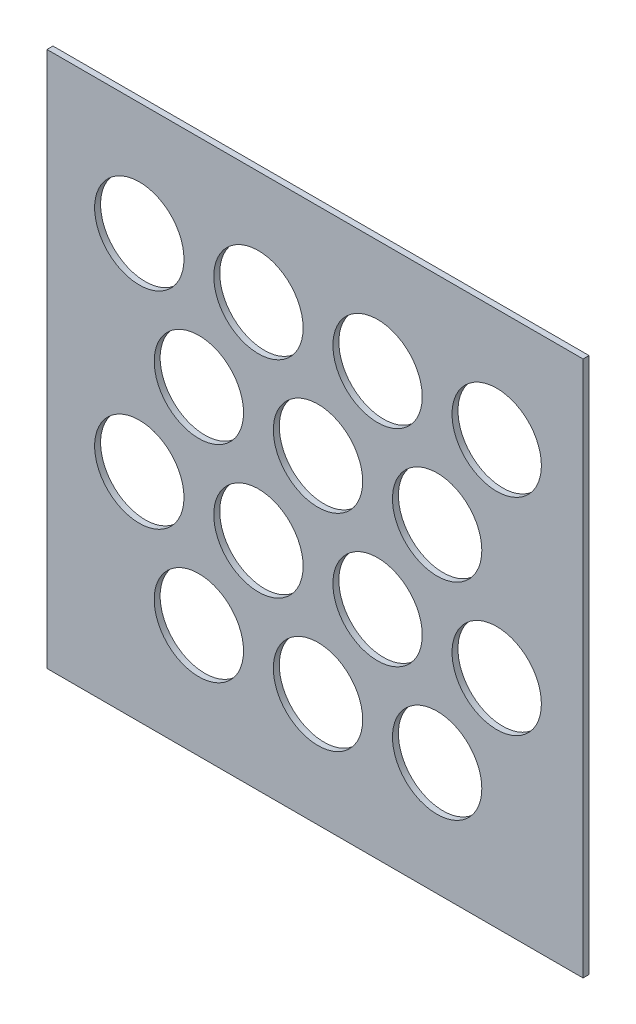
ISO-10303-21;
HEADER;
FILE_DESCRIPTION(('STEP AP214'),'2;1');
FILE_NAME('part.step','',(''),(''),'','','');
FILE_SCHEMA(('AUTOMOTIVE_DESIGN { 1 0 10303 214 1 1 1 1 }'));
ENDSEC;
DATA;
#1=APPLICATION_CONTEXT('core data for automotive mechanical design processes');
#2=APPLICATION_PROTOCOL_DEFINITION('international standard','automotive_design',2000,#1);
#3=PRODUCT_CONTEXT('',#1,'mechanical');
#4=PRODUCT('Part','Part','',(#3));
#5=PRODUCT_RELATED_PRODUCT_CATEGORY('part','',(#4));
#6=PRODUCT_DEFINITION_FORMATION('','',#4);
#7=PRODUCT_DEFINITION_CONTEXT('part definition',#1,'design');
#8=PRODUCT_DEFINITION('design','',#6,#7);
#9=PRODUCT_DEFINITION_SHAPE('','',#8);
#10=(LENGTH_UNIT() NAMED_UNIT(*) SI_UNIT(.MILLI.,.METRE.));
#11=(NAMED_UNIT(*) PLANE_ANGLE_UNIT() SI_UNIT($,.RADIAN.));
#12=(NAMED_UNIT(*) SI_UNIT($,.STERADIAN.) SOLID_ANGLE_UNIT());
#13=UNCERTAINTY_MEASURE_WITH_UNIT(LENGTH_MEASURE(1.E-05),#10,'distance_accuracy_value','');
#14=(GEOMETRIC_REPRESENTATION_CONTEXT(3) GLOBAL_UNCERTAINTY_ASSIGNED_CONTEXT((#13)) GLOBAL_UNIT_ASSIGNED_CONTEXT((#10,
#11,#12)) REPRESENTATION_CONTEXT('',''));
#15=CARTESIAN_POINT('',(0.,0.,0.));
#16=DIRECTION('',(0.,0.,1.));
#17=DIRECTION('',(1.,0.,0.));
#18=AXIS2_PLACEMENT_3D('',#15,#16,#17);
#19=CARTESIAN_POINT('',(-38.1,266.7,2.54));
#20=DIRECTION('',(-1.,0.,0.));
#21=DIRECTION('',(0.,-1.,0.));
#22=AXIS2_PLACEMENT_3D('',#19,#20,#21);
#23=PLANE('',#22);
#24=DIRECTION('',(0.,1.,0.));
#25=VECTOR('',#24,1.);
#26=CARTESIAN_POINT('',(-38.1,266.7,0.));
#27=LINE('',#26,#25);
#28=CARTESIAN_POINT('',(-38.0999999999999,38.0999999999999,0.));
#29=VERTEX_POINT('',#28);
#30=CARTESIAN_POINT('',(-38.1,266.7,0.));
#31=VERTEX_POINT('',#30);
#32=EDGE_CURVE('E104',#29,#31,#27,.T.);
#33=ORIENTED_EDGE('',*,*,#32,.T.);
#34=DIRECTION('',(0.,0.,-1.));
#35=VECTOR('',#34,1.);
#36=CARTESIAN_POINT('',(-38.1,266.7,2.54));
#37=LINE('',#36,#35);
#38=CARTESIAN_POINT('',(-38.1,266.7,2.54));
#39=VERTEX_POINT('',#38);
#40=EDGE_CURVE('E11',#39,#31,#37,.T.);
#41=ORIENTED_EDGE('',*,*,#40,.F.);
#42=DIRECTION('',(0.,1.,0.));
#43=VECTOR('',#42,1.);
#44=CARTESIAN_POINT('',(-38.1,266.7,2.54));
#45=LINE('',#44,#43);
#46=CARTESIAN_POINT('',(-38.0999999999999,38.0999999999999,2.54));
#47=VERTEX_POINT('',#46);
#48=EDGE_CURVE('E92',#47,#39,#45,.T.);
#49=ORIENTED_EDGE('',*,*,#48,.F.);
#50=DIRECTION('',(0.,0.,-1.));
#51=VECTOR('',#50,1.);
#52=CARTESIAN_POINT('',(-38.0999999999999,38.0999999999999,2.54));
#53=LINE('',#52,#51);
#54=EDGE_CURVE('E100',#47,#29,#53,.T.);
#55=ORIENTED_EDGE('',*,*,#54,.T.);
#56=EDGE_LOOP('',(#33,#41,#49,#55));
#57=FACE_BOUND('',#56,.T.);
#58=ADVANCED_FACE('F41',(#57),#23,.F.);
#59=CARTESIAN_POINT('',(-266.7,266.7,2.54));
#60=DIRECTION('',(0.,-1.,0.));
#61=DIRECTION('',(0.,0.,-1.));
#62=AXIS2_PLACEMENT_3D('',#59,#60,#61);
#63=PLANE('',#62);
#64=DIRECTION('',(-1.,0.,0.));
#65=VECTOR('',#64,1.);
#66=CARTESIAN_POINT('',(-266.7,266.7,0.));
#67=LINE('',#66,#65);
#68=CARTESIAN_POINT('',(-266.7,266.7,0.));
#69=VERTEX_POINT('',#68);
#70=EDGE_CURVE('E96',#31,#69,#67,.T.);
#71=ORIENTED_EDGE('',*,*,#70,.T.);
#72=DIRECTION('',(0.,0.,-1.));
#73=VECTOR('',#72,1.);
#74=CARTESIAN_POINT('',(-266.7,266.7,2.54));
#75=LINE('',#74,#73);
#76=CARTESIAN_POINT('',(-266.7,266.7,2.54));
#77=VERTEX_POINT('',#76);
#78=EDGE_CURVE('E49',#77,#69,#75,.T.);
#79=ORIENTED_EDGE('',*,*,#78,.F.);
#80=DIRECTION('',(-1.,0.,0.));
#81=VECTOR('',#80,1.);
#82=CARTESIAN_POINT('',(-266.7,266.7,2.54));
#83=LINE('',#82,#81);
#84=EDGE_CURVE('E87',#39,#77,#83,.T.);
#85=ORIENTED_EDGE('',*,*,#84,.F.);
#86=ORIENTED_EDGE('',*,*,#40,.T.);
#87=EDGE_LOOP('',(#71,#79,#85,#86));
#88=FACE_BOUND('',#87,.T.);
#89=ADVANCED_FACE('F95',(#88),#63,.F.);
#90=CARTESIAN_POINT('',(-266.7,266.7,2.54));
#91=DIRECTION('',(1.,0.,0.));
#92=DIRECTION('',(0.,0.,-1.));
#93=AXIS2_PLACEMENT_3D('',#90,#91,#92);
#94=PLANE('',#93);
#95=DIRECTION('',(0.,-1.,0.));
#96=VECTOR('',#95,1.);
#97=CARTESIAN_POINT('',(-266.7,266.7,0.));
#98=LINE('',#97,#96);
#99=CARTESIAN_POINT('',(-266.7,38.0999999999999,0.));
#100=VERTEX_POINT('',#99);
#101=EDGE_CURVE('E74',#69,#100,#98,.T.);
#102=ORIENTED_EDGE('',*,*,#101,.T.);
#103=DIRECTION('',(0.,0.,-1.));
#104=VECTOR('',#103,1.);
#105=CARTESIAN_POINT('',(-266.7,38.0999999999999,2.54));
#106=LINE('',#105,#104);
#107=CARTESIAN_POINT('',(-266.7,38.0999999999999,2.54));
#108=VERTEX_POINT('',#107);
#109=EDGE_CURVE('E97',#108,#100,#106,.T.);
#110=ORIENTED_EDGE('',*,*,#109,.F.);
#111=DIRECTION('',(0.,-1.,0.));
#112=VECTOR('',#111,1.);
#113=CARTESIAN_POINT('',(-266.7,266.7,2.54));
#114=LINE('',#113,#112);
#115=EDGE_CURVE('E90',#77,#108,#114,.T.);
#116=ORIENTED_EDGE('',*,*,#115,.F.);
#117=ORIENTED_EDGE('',*,*,#78,.T.);
#118=EDGE_LOOP('',(#102,#110,#116,#117));
#119=FACE_BOUND('',#118,.T.);
#120=ADVANCED_FACE('F98',(#119),#94,.F.);
#121=CARTESIAN_POINT('',(-266.7,38.0999999999999,2.54));
#122=DIRECTION('',(0.,1.,0.));
#123=DIRECTION('',(0.,0.,1.));
#124=AXIS2_PLACEMENT_3D('',#121,#122,#123);
#125=PLANE('',#124);
#126=DIRECTION('',(1.,0.,0.));
#127=VECTOR('',#126,1.);
#128=CARTESIAN_POINT('',(-266.7,38.0999999999999,0.));
#129=LINE('',#128,#127);
#130=EDGE_CURVE('E80',#100,#29,#129,.T.);
#131=ORIENTED_EDGE('',*,*,#130,.T.);
#132=ORIENTED_EDGE('',*,*,#54,.F.);
#133=DIRECTION('',(1.,0.,0.));
#134=VECTOR('',#133,1.);
#135=CARTESIAN_POINT('',(-266.7,38.0999999999999,2.54));
#136=LINE('',#135,#134);
#137=EDGE_CURVE('E57',#108,#47,#136,.T.);
#138=ORIENTED_EDGE('',*,*,#137,.F.);
#139=ORIENTED_EDGE('',*,*,#109,.T.);
#140=EDGE_LOOP('',(#131,#132,#138,#139));
#141=FACE_BOUND('',#140,.T.);
#142=ADVANCED_FACE('F112',(#141),#125,.F.);
#143=CARTESIAN_POINT('',(0.,0.,2.54));
#144=DIRECTION('',(0.,0.,1.));
#145=DIRECTION('',(1.,0.,0.));
#146=AXIS2_PLACEMENT_3D('',#143,#144,#145);
#147=PLANE('',#146);
#148=CARTESIAN_POINT('',(-151.13,86.4577284632513,2.54));
#149=DIRECTION('',(0.,0.,1.));
#150=DIRECTION('',(1.,0.,0.));
#151=AXIS2_PLACEMENT_3D('',#148,#149,#150);
#152=CIRCLE('',#151,19.05);
#153=CARTESIAN_POINT('',(-132.08,86.4577284632513,2.54));
#154=VERTEX_POINT('',#153);
#155=EDGE_CURVE('E146',#154,#154,#152,.T.);
#156=ORIENTED_EDGE('',*,*,#155,.F.);
#157=EDGE_LOOP('',(#156));
#158=FACE_BOUND('',#157,.T.);
#159=CARTESIAN_POINT('',(-125.73,218.44,2.54));
#160=DIRECTION('',(0.,0.,1.));
#161=DIRECTION('',(1.,0.,0.));
#162=AXIS2_PLACEMENT_3D('',#159,#160,#161);
#163=CIRCLE('',#162,19.05);
#164=CARTESIAN_POINT('',(-106.68,218.44,2.54));
#165=VERTEX_POINT('',#164);
#166=EDGE_CURVE('E157',#165,#165,#163,.T.);
#167=ORIENTED_EDGE('',*,*,#166,.F.);
#168=EDGE_LOOP('',(#167));
#169=FACE_BOUND('',#168,.T.);
#170=CARTESIAN_POINT('',(-151.13,174.44590948775,2.54));
#171=DIRECTION('',(0.,0.,1.));
#172=DIRECTION('',(1.,0.,0.));
#173=AXIS2_PLACEMENT_3D('',#170,#171,#172);
#174=CIRCLE('',#173,19.05);
#175=CARTESIAN_POINT('',(-132.08,174.44590948775,2.54));
#176=VERTEX_POINT('',#175);
#177=EDGE_CURVE('E158',#176,#176,#174,.T.);
#178=ORIENTED_EDGE('',*,*,#177,.F.);
#179=EDGE_LOOP('',(#178));
#180=FACE_BOUND('',#179,.T.);
#181=CARTESIAN_POINT('',(-176.53,130.451818975501,2.54));
#182=DIRECTION('',(0.,0.,1.));
#183=DIRECTION('',(1.,0.,0.));
#184=AXIS2_PLACEMENT_3D('',#181,#182,#183);
#185=CIRCLE('',#184,19.05);
#186=CARTESIAN_POINT('',(-157.48,130.451818975501,2.54));
#187=VERTEX_POINT('',#186);
#188=EDGE_CURVE('E169',#187,#187,#185,.T.);
#189=ORIENTED_EDGE('',*,*,#188,.F.);
#190=EDGE_LOOP('',(#189));
#191=FACE_BOUND('',#190,.T.);
#192=CARTESIAN_POINT('',(-100.33,86.4577284632513,2.54));
#193=DIRECTION('',(0.,0.,1.));
#194=DIRECTION('',(1.,0.,0.));
#195=AXIS2_PLACEMENT_3D('',#192,#193,#194);
#196=CIRCLE('',#195,19.05);
#197=CARTESIAN_POINT('',(-81.2800000000005,86.4577284632513,2.54));
#198=VERTEX_POINT('',#197);
#199=EDGE_CURVE('E127',#198,#198,#196,.T.);
#200=ORIENTED_EDGE('',*,*,#199,.F.);
#201=EDGE_LOOP('',(#200));
#202=FACE_BOUND('',#201,.T.);
#203=CARTESIAN_POINT('',(-74.9300000000005,218.44,2.54));
#204=DIRECTION('',(0.,0.,1.));
#205=DIRECTION('',(1.,0.,0.));
#206=AXIS2_PLACEMENT_3D('',#203,#204,#205);
#207=CIRCLE('',#206,19.05);
#208=CARTESIAN_POINT('',(-55.8800000000005,218.44,2.54));
#209=VERTEX_POINT('',#208);
#210=EDGE_CURVE('E133',#209,#209,#207,.T.);
#211=ORIENTED_EDGE('',*,*,#210,.F.);
#212=EDGE_LOOP('',(#211));
#213=FACE_BOUND('',#212,.T.);
#214=CARTESIAN_POINT('',(-100.33,174.44590948775,2.54));
#215=DIRECTION('',(0.,0.,1.));
#216=DIRECTION('',(1.,0.,0.));
#217=AXIS2_PLACEMENT_3D('',#214,#215,#216);
#218=CIRCLE('',#217,19.05);
#219=CARTESIAN_POINT('',(-81.2800000000004,174.44590948775,2.54));
#220=VERTEX_POINT('',#219);
#221=EDGE_CURVE('E134',#220,#220,#218,.T.);
#222=ORIENTED_EDGE('',*,*,#221,.F.);
#223=EDGE_LOOP('',(#222));
#224=FACE_BOUND('',#223,.T.);
#225=CARTESIAN_POINT('',(-125.73,130.451818975501,2.54));
#226=DIRECTION('',(0.,0.,1.));
#227=DIRECTION('',(1.,0.,0.));
#228=AXIS2_PLACEMENT_3D('',#225,#226,#227);
#229=CIRCLE('',#228,19.05);
#230=CARTESIAN_POINT('',(-106.68,130.451818975501,2.54));
#231=VERTEX_POINT('',#230);
#232=EDGE_CURVE('E145',#231,#231,#229,.T.);
#233=ORIENTED_EDGE('',*,*,#232,.F.);
#234=EDGE_LOOP('',(#233));
#235=FACE_BOUND('',#234,.T.);
#236=CARTESIAN_POINT('',(-227.33,130.451818975501,2.54));
#237=DIRECTION('',(0.,0.,1.));
#238=DIRECTION('',(1.,0.,0.));
#239=AXIS2_PLACEMENT_3D('',#236,#237,#238);
#240=CIRCLE('',#239,19.05);
#241=CARTESIAN_POINT('',(-208.28,130.451818975501,2.54));
#242=VERTEX_POINT('',#241);
#243=EDGE_CURVE('E193',#242,#242,#240,.T.);
#244=ORIENTED_EDGE('',*,*,#243,.F.);
#245=EDGE_LOOP('',(#244));
#246=FACE_BOUND('',#245,.T.);
#247=CARTESIAN_POINT('',(-201.93,174.44590948775,2.54));
#248=DIRECTION('',(0.,0.,1.));
#249=DIRECTION('',(1.,0.,0.));
#250=AXIS2_PLACEMENT_3D('',#247,#248,#249);
#251=CIRCLE('',#250,19.05);
#252=CARTESIAN_POINT('',(-182.88,174.44590948775,2.54));
#253=VERTEX_POINT('',#252);
#254=EDGE_CURVE('E182',#253,#253,#251,.T.);
#255=ORIENTED_EDGE('',*,*,#254,.F.);
#256=EDGE_LOOP('',(#255));
#257=FACE_BOUND('',#256,.T.);
#258=CARTESIAN_POINT('',(-176.53,218.44,2.54));
#259=DIRECTION('',(0.,0.,1.));
#260=DIRECTION('',(1.,0.,0.));
#261=AXIS2_PLACEMENT_3D('',#258,#259,#260);
#262=CIRCLE('',#261,19.05);
#263=CARTESIAN_POINT('',(-157.48,218.44,2.54));
#264=VERTEX_POINT('',#263);
#265=EDGE_CURVE('E181',#264,#264,#262,.T.);
#266=ORIENTED_EDGE('',*,*,#265,.F.);
#267=EDGE_LOOP('',(#266));
#268=FACE_BOUND('',#267,.T.);
#269=CARTESIAN_POINT('',(-201.93,86.4577284632514,2.54));
#270=DIRECTION('',(0.,0.,1.));
#271=DIRECTION('',(1.,0.,0.));
#272=AXIS2_PLACEMENT_3D('',#269,#270,#271);
#273=CIRCLE('',#272,19.05);
#274=CARTESIAN_POINT('',(-182.88,86.4577284632514,2.54));
#275=VERTEX_POINT('',#274);
#276=EDGE_CURVE('E170',#275,#275,#273,.T.);
#277=ORIENTED_EDGE('',*,*,#276,.F.);
#278=EDGE_LOOP('',(#277));
#279=FACE_BOUND('',#278,.T.);
#280=CARTESIAN_POINT('',(-74.9300000000005,130.451818975501,2.54));
#281=DIRECTION('',(0.,0.,1.));
#282=DIRECTION('',(1.,0.,0.));
#283=AXIS2_PLACEMENT_3D('',#280,#281,#282);
#284=CIRCLE('',#283,19.05);
#285=CARTESIAN_POINT('',(-55.8800000000005,130.451818975501,2.54));
#286=VERTEX_POINT('',#285);
#287=EDGE_CURVE('E121',#286,#286,#284,.T.);
#288=ORIENTED_EDGE('',*,*,#287,.F.);
#289=EDGE_LOOP('',(#288));
#290=FACE_BOUND('',#289,.T.);
#291=CARTESIAN_POINT('',(-227.33,218.44,2.54));
#292=DIRECTION('',(0.,0.,1.));
#293=DIRECTION('',(1.,0.,0.));
#294=AXIS2_PLACEMENT_3D('',#291,#292,#293);
#295=CIRCLE('',#294,19.05);
#296=CARTESIAN_POINT('',(-208.28,218.44,2.54));
#297=VERTEX_POINT('',#296);
#298=EDGE_CURVE('E107',#297,#297,#295,.T.);
#299=ORIENTED_EDGE('',*,*,#298,.F.);
#300=EDGE_LOOP('',(#299));
#301=FACE_BOUND('',#300,.T.);
#302=ORIENTED_EDGE('',*,*,#48,.T.);
#303=ORIENTED_EDGE('',*,*,#84,.T.);
#304=ORIENTED_EDGE('',*,*,#115,.T.);
#305=ORIENTED_EDGE('',*,*,#137,.T.);
#306=EDGE_LOOP('',(#302,#303,#304,#305));
#307=FACE_BOUND('',#306,.T.);
#308=ADVANCED_FACE('F88',(#158,#169,#180,#191,#202,#213,#224,#235,#246,#257,#268,#279,#290,#301,
#307),#147,.T.);
#309=CARTESIAN_POINT('',(0.,0.,0.));
#310=DIRECTION('',(0.,0.,1.));
#311=DIRECTION('',(1.,0.,0.));
#312=AXIS2_PLACEMENT_3D('',#309,#310,#311);
#313=PLANE('',#312);
#314=CARTESIAN_POINT('',(-151.13,86.4577284632513,0.));
#315=DIRECTION('',(0.,0.,1.));
#316=DIRECTION('',(1.,0.,0.));
#317=AXIS2_PLACEMENT_3D('',#314,#315,#316);
#318=CIRCLE('',#317,19.05);
#319=CARTESIAN_POINT('',(-132.08,86.4577284632513,0.));
#320=VERTEX_POINT('',#319);
#321=EDGE_CURVE('E161',#320,#320,#318,.T.);
#322=ORIENTED_EDGE('',*,*,#321,.T.);
#323=EDGE_LOOP('',(#322));
#324=FACE_BOUND('',#323,.T.);
#325=CARTESIAN_POINT('',(-125.73,218.44,0.));
#326=DIRECTION('',(0.,0.,1.));
#327=DIRECTION('',(1.,0.,0.));
#328=AXIS2_PLACEMENT_3D('',#325,#326,#327);
#329=CIRCLE('',#328,19.05);
#330=CARTESIAN_POINT('',(-106.68,218.44,0.));
#331=VERTEX_POINT('',#330);
#332=EDGE_CURVE('E154',#331,#331,#329,.T.);
#333=ORIENTED_EDGE('',*,*,#332,.T.);
#334=EDGE_LOOP('',(#333));
#335=FACE_BOUND('',#334,.T.);
#336=CARTESIAN_POINT('',(-151.13,174.44590948775,0.));
#337=DIRECTION('',(0.,0.,1.));
#338=DIRECTION('',(1.,0.,0.));
#339=AXIS2_PLACEMENT_3D('',#336,#337,#338);
#340=CIRCLE('',#339,19.05);
#341=CARTESIAN_POINT('',(-132.08,174.44590948775,0.));
#342=VERTEX_POINT('',#341);
#343=EDGE_CURVE('E173',#342,#342,#340,.T.);
#344=ORIENTED_EDGE('',*,*,#343,.T.);
#345=EDGE_LOOP('',(#344));
#346=FACE_BOUND('',#345,.T.);
#347=CARTESIAN_POINT('',(-176.53,130.451818975501,0.));
#348=DIRECTION('',(0.,0.,1.));
#349=DIRECTION('',(1.,0.,0.));
#350=AXIS2_PLACEMENT_3D('',#347,#348,#349);
#351=CIRCLE('',#350,19.05);
#352=CARTESIAN_POINT('',(-157.48,130.451818975501,0.));
#353=VERTEX_POINT('',#352);
#354=EDGE_CURVE('E166',#353,#353,#351,.T.);
#355=ORIENTED_EDGE('',*,*,#354,.T.);
#356=EDGE_LOOP('',(#355));
#357=FACE_BOUND('',#356,.T.);
#358=CARTESIAN_POINT('',(-100.33,86.4577284632513,0.));
#359=DIRECTION('',(0.,0.,1.));
#360=DIRECTION('',(1.,0.,0.));
#361=AXIS2_PLACEMENT_3D('',#358,#359,#360);
#362=CIRCLE('',#361,19.05);
#363=CARTESIAN_POINT('',(-81.2800000000005,86.4577284632513,0.));
#364=VERTEX_POINT('',#363);
#365=EDGE_CURVE('E137',#364,#364,#362,.T.);
#366=ORIENTED_EDGE('',*,*,#365,.T.);
#367=EDGE_LOOP('',(#366));
#368=FACE_BOUND('',#367,.T.);
#369=CARTESIAN_POINT('',(-74.9300000000005,218.44,0.));
#370=DIRECTION('',(0.,0.,1.));
#371=DIRECTION('',(1.,0.,0.));
#372=AXIS2_PLACEMENT_3D('',#369,#370,#371);
#373=CIRCLE('',#372,19.05);
#374=CARTESIAN_POINT('',(-55.8800000000005,218.44,0.));
#375=VERTEX_POINT('',#374);
#376=EDGE_CURVE('E130',#375,#375,#373,.T.);
#377=ORIENTED_EDGE('',*,*,#376,.T.);
#378=EDGE_LOOP('',(#377));
#379=FACE_BOUND('',#378,.T.);
#380=CARTESIAN_POINT('',(-100.33,174.44590948775,0.));
#381=DIRECTION('',(0.,0.,1.));
#382=DIRECTION('',(1.,0.,0.));
#383=AXIS2_PLACEMENT_3D('',#380,#381,#382);
#384=CIRCLE('',#383,19.05);
#385=CARTESIAN_POINT('',(-81.2800000000004,174.44590948775,0.));
#386=VERTEX_POINT('',#385);
#387=EDGE_CURVE('E149',#386,#386,#384,.T.);
#388=ORIENTED_EDGE('',*,*,#387,.T.);
#389=EDGE_LOOP('',(#388));
#390=FACE_BOUND('',#389,.T.);
#391=CARTESIAN_POINT('',(-125.73,130.451818975501,0.));
#392=DIRECTION('',(0.,0.,1.));
#393=DIRECTION('',(1.,0.,0.));
#394=AXIS2_PLACEMENT_3D('',#391,#392,#393);
#395=CIRCLE('',#394,19.05);
#396=CARTESIAN_POINT('',(-106.68,130.451818975501,0.));
#397=VERTEX_POINT('',#396);
#398=EDGE_CURVE('E142',#397,#397,#395,.T.);
#399=ORIENTED_EDGE('',*,*,#398,.T.);
#400=EDGE_LOOP('',(#399));
#401=FACE_BOUND('',#400,.T.);
#402=CARTESIAN_POINT('',(-227.33,130.451818975501,0.));
#403=DIRECTION('',(0.,0.,1.));
#404=DIRECTION('',(1.,0.,0.));
#405=AXIS2_PLACEMENT_3D('',#402,#403,#404);
#406=CIRCLE('',#405,19.05);
#407=CARTESIAN_POINT('',(-208.28,130.451818975501,0.));
#408=VERTEX_POINT('',#407);
#409=EDGE_CURVE('E190',#408,#408,#406,.T.);
#410=ORIENTED_EDGE('',*,*,#409,.T.);
#411=EDGE_LOOP('',(#410));
#412=FACE_BOUND('',#411,.T.);
#413=CARTESIAN_POINT('',(-201.93,174.44590948775,0.));
#414=DIRECTION('',(0.,0.,1.));
#415=DIRECTION('',(1.,0.,0.));
#416=AXIS2_PLACEMENT_3D('',#413,#414,#415);
#417=CIRCLE('',#416,19.05);
#418=CARTESIAN_POINT('',(-182.88,174.44590948775,0.));
#419=VERTEX_POINT('',#418);
#420=EDGE_CURVE('E196',#419,#419,#417,.T.);
#421=ORIENTED_EDGE('',*,*,#420,.T.);
#422=EDGE_LOOP('',(#421));
#423=FACE_BOUND('',#422,.T.);
#424=CARTESIAN_POINT('',(-176.53,218.44,0.));
#425=DIRECTION('',(0.,0.,1.));
#426=DIRECTION('',(1.,0.,0.));
#427=AXIS2_PLACEMENT_3D('',#424,#425,#426);
#428=CIRCLE('',#427,19.05);
#429=CARTESIAN_POINT('',(-157.48,218.44,0.));
#430=VERTEX_POINT('',#429);
#431=EDGE_CURVE('E178',#430,#430,#428,.T.);
#432=ORIENTED_EDGE('',*,*,#431,.T.);
#433=EDGE_LOOP('',(#432));
#434=FACE_BOUND('',#433,.T.);
#435=CARTESIAN_POINT('',(-201.93,86.4577284632514,0.));
#436=DIRECTION('',(0.,0.,1.));
#437=DIRECTION('',(1.,0.,0.));
#438=AXIS2_PLACEMENT_3D('',#435,#436,#437);
#439=CIRCLE('',#438,19.05);
#440=CARTESIAN_POINT('',(-182.88,86.4577284632514,0.));
#441=VERTEX_POINT('',#440);
#442=EDGE_CURVE('E185',#441,#441,#439,.T.);
#443=ORIENTED_EDGE('',*,*,#442,.T.);
#444=EDGE_LOOP('',(#443));
#445=FACE_BOUND('',#444,.T.);
#446=CARTESIAN_POINT('',(-74.9300000000005,130.451818975501,0.));
#447=DIRECTION('',(0.,0.,1.));
#448=DIRECTION('',(1.,0.,0.));
#449=AXIS2_PLACEMENT_3D('',#446,#447,#448);
#450=CIRCLE('',#449,19.05);
#451=CARTESIAN_POINT('',(-55.8800000000005,130.451818975501,0.));
#452=VERTEX_POINT('',#451);
#453=EDGE_CURVE('E124',#452,#452,#450,.T.);
#454=ORIENTED_EDGE('',*,*,#453,.T.);
#455=EDGE_LOOP('',(#454));
#456=FACE_BOUND('',#455,.T.);
#457=CARTESIAN_POINT('',(-227.33,218.44,0.));
#458=DIRECTION('',(0.,0.,1.));
#459=DIRECTION('',(1.,0.,0.));
#460=AXIS2_PLACEMENT_3D('',#457,#458,#459);
#461=CIRCLE('',#460,19.05);
#462=CARTESIAN_POINT('',(-208.28,218.44,0.));
#463=VERTEX_POINT('',#462);
#464=EDGE_CURVE('E118',#463,#463,#461,.T.);
#465=ORIENTED_EDGE('',*,*,#464,.T.);
#466=EDGE_LOOP('',(#465));
#467=FACE_BOUND('',#466,.T.);
#468=ORIENTED_EDGE('',*,*,#32,.F.);
#469=ORIENTED_EDGE('',*,*,#130,.F.);
#470=ORIENTED_EDGE('',*,*,#101,.F.);
#471=ORIENTED_EDGE('',*,*,#70,.F.);
#472=EDGE_LOOP('',(#468,#469,#470,#471));
#473=FACE_BOUND('',#472,.T.);
#474=ADVANCED_FACE('F115',(#324,#335,#346,#357,#368,#379,#390,#401,#412,#423,#434,#445,#456,
#467,#473),#313,.F.);
#475=CARTESIAN_POINT('',(-227.33,218.44,2.54));
#476=DIRECTION('',(0.,0.,-1.));
#477=DIRECTION('',(-1.,0.,0.));
#478=AXIS2_PLACEMENT_3D('',#475,#476,#477);
#479=CYLINDRICAL_SURFACE('',#478,19.05);
#480=ORIENTED_EDGE('',*,*,#298,.T.);
#481=EDGE_LOOP('',(#480));
#482=FACE_BOUND('',#481,.T.);
#483=ORIENTED_EDGE('',*,*,#464,.F.);
#484=EDGE_LOOP('',(#483));
#485=FACE_BOUND('',#484,.T.);
#486=ADVANCED_FACE('F217',(#482,#485),#479,.F.);
#487=CARTESIAN_POINT('',(-74.9300000000005,130.451818975501,2.54));
#488=DIRECTION('',(0.,0.,-1.));
#489=DIRECTION('',(-1.,0.,0.));
#490=AXIS2_PLACEMENT_3D('',#487,#488,#489);
#491=CYLINDRICAL_SURFACE('',#490,19.05);
#492=ORIENTED_EDGE('',*,*,#287,.T.);
#493=EDGE_LOOP('',(#492));
#494=FACE_BOUND('',#493,.T.);
#495=ORIENTED_EDGE('',*,*,#453,.F.);
#496=EDGE_LOOP('',(#495));
#497=FACE_BOUND('',#496,.T.);
#498=ADVANCED_FACE('F220',(#494,#497),#491,.F.);
#499=CARTESIAN_POINT('',(-201.93,86.4577284632514,2.54));
#500=DIRECTION('',(0.,0.,-1.));
#501=DIRECTION('',(-1.,0.,0.));
#502=AXIS2_PLACEMENT_3D('',#499,#500,#501);
#503=CYLINDRICAL_SURFACE('',#502,19.05);
#504=ORIENTED_EDGE('',*,*,#276,.T.);
#505=EDGE_LOOP('',(#504));
#506=FACE_BOUND('',#505,.T.);
#507=ORIENTED_EDGE('',*,*,#442,.F.);
#508=EDGE_LOOP('',(#507));
#509=FACE_BOUND('',#508,.T.);
#510=ADVANCED_FACE('F269',(#506,#509),#503,.F.);
#511=CARTESIAN_POINT('',(-176.53,218.44,2.54));
#512=DIRECTION('',(0.,0.,-1.));
#513=DIRECTION('',(-1.,0.,0.));
#514=AXIS2_PLACEMENT_3D('',#511,#512,#513);
#515=CYLINDRICAL_SURFACE('',#514,19.05);
#516=ORIENTED_EDGE('',*,*,#265,.T.);
#517=EDGE_LOOP('',(#516));
#518=FACE_BOUND('',#517,.T.);
#519=ORIENTED_EDGE('',*,*,#431,.F.);
#520=EDGE_LOOP('',(#519));
#521=FACE_BOUND('',#520,.T.);
#522=ADVANCED_FACE('F278',(#518,#521),#515,.F.);
#523=CARTESIAN_POINT('',(-201.93,174.44590948775,2.54));
#524=DIRECTION('',(0.,0.,-1.));
#525=DIRECTION('',(-1.,0.,0.));
#526=AXIS2_PLACEMENT_3D('',#523,#524,#525);
#527=CYLINDRICAL_SURFACE('',#526,19.05);
#528=ORIENTED_EDGE('',*,*,#254,.T.);
#529=EDGE_LOOP('',(#528));
#530=FACE_BOUND('',#529,.T.);
#531=ORIENTED_EDGE('',*,*,#420,.F.);
#532=EDGE_LOOP('',(#531));
#533=FACE_BOUND('',#532,.T.);
#534=ADVANCED_FACE('F202',(#530,#533),#527,.F.);
#535=CARTESIAN_POINT('',(-227.33,130.451818975501,2.54));
#536=DIRECTION('',(0.,0.,-1.));
#537=DIRECTION('',(-1.,0.,0.));
#538=AXIS2_PLACEMENT_3D('',#535,#536,#537);
#539=CYLINDRICAL_SURFACE('',#538,19.05);
#540=ORIENTED_EDGE('',*,*,#243,.T.);
#541=EDGE_LOOP('',(#540));
#542=FACE_BOUND('',#541,.T.);
#543=ORIENTED_EDGE('',*,*,#409,.F.);
#544=EDGE_LOOP('',(#543));
#545=FACE_BOUND('',#544,.T.);
#546=ADVANCED_FACE('F295',(#542,#545),#539,.F.);
#547=CARTESIAN_POINT('',(-125.73,130.451818975501,2.54));
#548=DIRECTION('',(0.,0.,-1.));
#549=DIRECTION('',(-1.,0.,0.));
#550=AXIS2_PLACEMENT_3D('',#547,#548,#549);
#551=CYLINDRICAL_SURFACE('',#550,19.05);
#552=ORIENTED_EDGE('',*,*,#232,.T.);
#553=EDGE_LOOP('',(#552));
#554=FACE_BOUND('',#553,.T.);
#555=ORIENTED_EDGE('',*,*,#398,.F.);
#556=EDGE_LOOP('',(#555));
#557=FACE_BOUND('',#556,.T.);
#558=ADVANCED_FACE('F303',(#554,#557),#551,.F.);
#559=CARTESIAN_POINT('',(-100.33,174.44590948775,2.54));
#560=DIRECTION('',(0.,0.,-1.));
#561=DIRECTION('',(-1.,0.,0.));
#562=AXIS2_PLACEMENT_3D('',#559,#560,#561);
#563=CYLINDRICAL_SURFACE('',#562,19.05);
#564=ORIENTED_EDGE('',*,*,#221,.T.);
#565=EDGE_LOOP('',(#564));
#566=FACE_BOUND('',#565,.T.);
#567=ORIENTED_EDGE('',*,*,#387,.F.);
#568=EDGE_LOOP('',(#567));
#569=FACE_BOUND('',#568,.T.);
#570=ADVANCED_FACE('F312',(#566,#569),#563,.F.);
#571=CARTESIAN_POINT('',(-74.9300000000005,218.44,2.54));
#572=DIRECTION('',(0.,0.,-1.));
#573=DIRECTION('',(-1.,0.,0.));
#574=AXIS2_PLACEMENT_3D('',#571,#572,#573);
#575=CYLINDRICAL_SURFACE('',#574,19.05);
#576=ORIENTED_EDGE('',*,*,#210,.T.);
#577=EDGE_LOOP('',(#576));
#578=FACE_BOUND('',#577,.T.);
#579=ORIENTED_EDGE('',*,*,#376,.F.);
#580=EDGE_LOOP('',(#579));
#581=FACE_BOUND('',#580,.T.);
#582=ADVANCED_FACE('F321',(#578,#581),#575,.F.);
#583=CARTESIAN_POINT('',(-100.33,86.4577284632513,2.54));
#584=DIRECTION('',(0.,0.,-1.));
#585=DIRECTION('',(-1.,0.,0.));
#586=AXIS2_PLACEMENT_3D('',#583,#584,#585);
#587=CYLINDRICAL_SURFACE('',#586,19.05);
#588=ORIENTED_EDGE('',*,*,#199,.T.);
#589=EDGE_LOOP('',(#588));
#590=FACE_BOUND('',#589,.T.);
#591=ORIENTED_EDGE('',*,*,#365,.F.);
#592=EDGE_LOOP('',(#591));
#593=FACE_BOUND('',#592,.T.);
#594=ADVANCED_FACE('F330',(#590,#593),#587,.F.);
#595=CARTESIAN_POINT('',(-176.53,130.451818975501,2.54));
#596=DIRECTION('',(0.,0.,-1.));
#597=DIRECTION('',(-1.,0.,0.));
#598=AXIS2_PLACEMENT_3D('',#595,#596,#597);
#599=CYLINDRICAL_SURFACE('',#598,19.05);
#600=ORIENTED_EDGE('',*,*,#188,.T.);
#601=EDGE_LOOP('',(#600));
#602=FACE_BOUND('',#601,.T.);
#603=ORIENTED_EDGE('',*,*,#354,.F.);
#604=EDGE_LOOP('',(#603));
#605=FACE_BOUND('',#604,.T.);
#606=ADVANCED_FACE('F339',(#602,#605),#599,.F.);
#607=CARTESIAN_POINT('',(-151.13,174.44590948775,2.54));
#608=DIRECTION('',(0.,0.,-1.));
#609=DIRECTION('',(-1.,0.,0.));
#610=AXIS2_PLACEMENT_3D('',#607,#608,#609);
#611=CYLINDRICAL_SURFACE('',#610,19.05);
#612=ORIENTED_EDGE('',*,*,#177,.T.);
#613=EDGE_LOOP('',(#612));
#614=FACE_BOUND('',#613,.T.);
#615=ORIENTED_EDGE('',*,*,#343,.F.);
#616=EDGE_LOOP('',(#615));
#617=FACE_BOUND('',#616,.T.);
#618=ADVANCED_FACE('F348',(#614,#617),#611,.F.);
#619=CARTESIAN_POINT('',(-125.73,218.44,2.54));
#620=DIRECTION('',(0.,0.,-1.));
#621=DIRECTION('',(-1.,0.,0.));
#622=AXIS2_PLACEMENT_3D('',#619,#620,#621);
#623=CYLINDRICAL_SURFACE('',#622,19.05);
#624=ORIENTED_EDGE('',*,*,#166,.T.);
#625=EDGE_LOOP('',(#624));
#626=FACE_BOUND('',#625,.T.);
#627=ORIENTED_EDGE('',*,*,#332,.F.);
#628=EDGE_LOOP('',(#627));
#629=FACE_BOUND('',#628,.T.);
#630=ADVANCED_FACE('F357',(#626,#629),#623,.F.);
#631=CARTESIAN_POINT('',(-151.13,86.4577284632513,2.54));
#632=DIRECTION('',(0.,0.,-1.));
#633=DIRECTION('',(-1.,0.,0.));
#634=AXIS2_PLACEMENT_3D('',#631,#632,#633);
#635=CYLINDRICAL_SURFACE('',#634,19.05);
#636=ORIENTED_EDGE('',*,*,#155,.T.);
#637=EDGE_LOOP('',(#636));
#638=FACE_BOUND('',#637,.T.);
#639=ORIENTED_EDGE('',*,*,#321,.F.);
#640=EDGE_LOOP('',(#639));
#641=FACE_BOUND('',#640,.T.);
#642=ADVANCED_FACE('F366',(#638,#641),#635,.F.);
#643=CLOSED_SHELL('',(#58,#89,#120,#142,#308,#474,#486,#498,#510,#522,#534,#546,#558,#570,#582,
#594,#606,#618,#630,#642));
#644=MANIFOLD_SOLID_BREP('B2',#643);
#645=ADVANCED_BREP_SHAPE_REPRESENTATION('',(#18,#644),#14);
#646=SHAPE_DEFINITION_REPRESENTATION(#9,#645);
ENDSEC;
END-ISO-10303-21;
